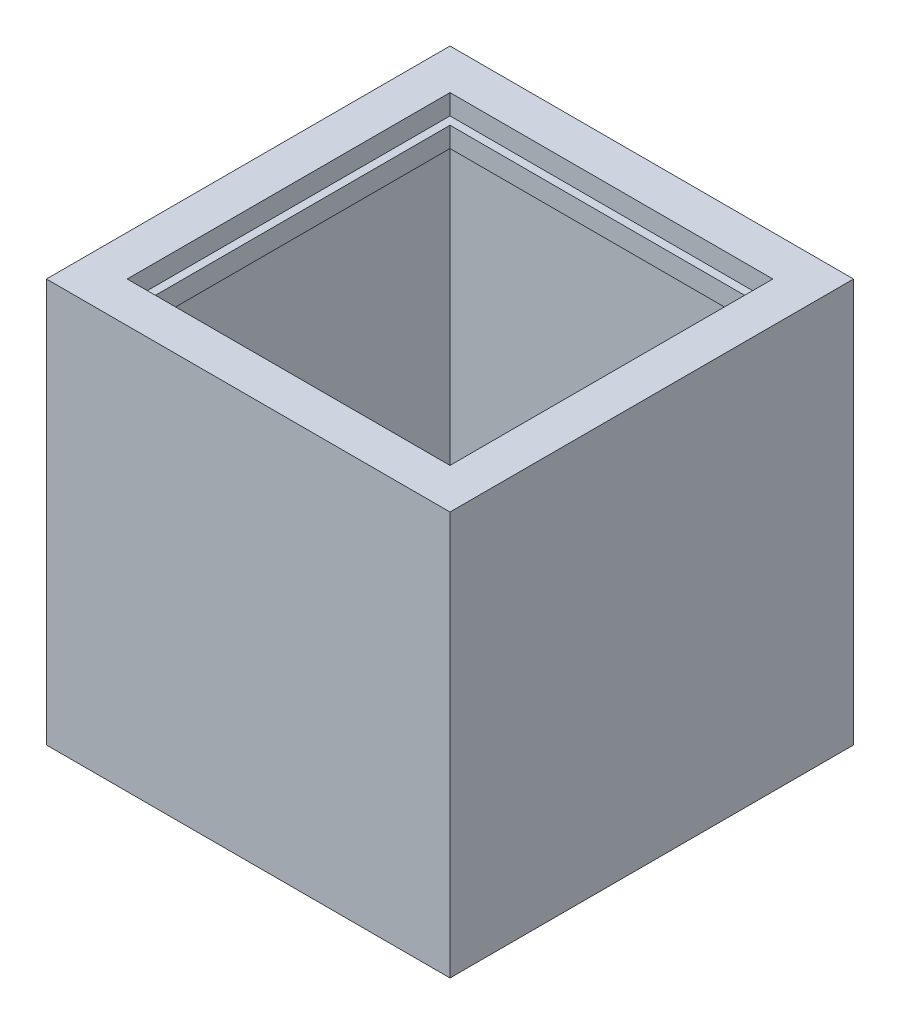
ISO-10303-21;
HEADER;
FILE_DESCRIPTION(('STEP AP214'),'2;1');
FILE_NAME('part.step','',(''),(''),'','','');
FILE_SCHEMA(('AUTOMOTIVE_DESIGN { 1 0 10303 214 1 1 1 1 }'));
ENDSEC;
DATA;
#1=APPLICATION_CONTEXT('core data for automotive mechanical design processes');
#2=APPLICATION_PROTOCOL_DEFINITION('international standard','automotive_design',2000,#1);
#3=PRODUCT_CONTEXT('',#1,'mechanical');
#4=PRODUCT('Part','Part','',(#3));
#5=PRODUCT_RELATED_PRODUCT_CATEGORY('part','',(#4));
#6=PRODUCT_DEFINITION_FORMATION('','',#4);
#7=PRODUCT_DEFINITION_CONTEXT('part definition',#1,'design');
#8=PRODUCT_DEFINITION('design','',#6,#7);
#9=PRODUCT_DEFINITION_SHAPE('','',#8);
#10=(LENGTH_UNIT() NAMED_UNIT(*) SI_UNIT(.MILLI.,.METRE.));
#11=(NAMED_UNIT(*) PLANE_ANGLE_UNIT() SI_UNIT($,.RADIAN.));
#12=(NAMED_UNIT(*) SI_UNIT($,.STERADIAN.) SOLID_ANGLE_UNIT());
#13=UNCERTAINTY_MEASURE_WITH_UNIT(LENGTH_MEASURE(1.E-05),#10,'distance_accuracy_value','');
#14=(GEOMETRIC_REPRESENTATION_CONTEXT(3) GLOBAL_UNCERTAINTY_ASSIGNED_CONTEXT((#13)) GLOBAL_UNIT_ASSIGNED_CONTEXT((#10,
#11,#12)) REPRESENTATION_CONTEXT('',''));
#15=CARTESIAN_POINT('',(0.,0.,0.));
#16=DIRECTION('',(0.,0.,1.));
#17=DIRECTION('',(1.,0.,0.));
#18=AXIS2_PLACEMENT_3D('',#15,#16,#17);
#19=CARTESIAN_POINT('',(-48.26,-54.61,15.24));
#20=DIRECTION('',(-1.,0.,0.));
#21=DIRECTION('',(0.,0.,1.));
#22=AXIS2_PLACEMENT_3D('',#19,#20,#21);
#23=PLANE('',#22);
#24=DIRECTION('',(0.,0.,-1.));
#25=VECTOR('',#24,1.);
#26=CARTESIAN_POINT('',(-48.26,50.8,8.89));
#27=LINE('',#26,#25);
#28=CARTESIAN_POINT('',(-48.26,50.8,111.76));
#29=VERTEX_POINT('',#28);
#30=CARTESIAN_POINT('',(-48.26,50.8,15.24));
#31=VERTEX_POINT('',#30);
#32=EDGE_CURVE('E190',#29,#31,#27,.T.);
#33=ORIENTED_EDGE('',*,*,#32,.T.);
#34=DIRECTION('',(0.,1.,0.));
#35=VECTOR('',#34,1.);
#36=CARTESIAN_POINT('',(-48.26,-54.61,15.24));
#37=LINE('',#36,#35);
#38=CARTESIAN_POINT('',(-48.26,57.15,15.24));
#39=VERTEX_POINT('',#38);
#40=EDGE_CURVE('E277',#31,#39,#37,.T.);
#41=ORIENTED_EDGE('',*,*,#40,.T.);
#42=DIRECTION('',(0.,0.,1.));
#43=VECTOR('',#42,1.);
#44=CARTESIAN_POINT('',(-48.26,57.15,15.24));
#45=LINE('',#44,#43);
#46=CARTESIAN_POINT('',(-48.26,57.15,111.76));
#47=VERTEX_POINT('',#46);
#48=EDGE_CURVE('E172',#39,#47,#45,.T.);
#49=ORIENTED_EDGE('',*,*,#48,.T.);
#50=DIRECTION('',(0.,1.,0.));
#51=VECTOR('',#50,1.);
#52=CARTESIAN_POINT('',(-48.26,-54.61,111.76));
#53=LINE('',#52,#51);
#54=EDGE_CURVE('E69',#29,#47,#53,.T.);
#55=ORIENTED_EDGE('',*,*,#54,.F.);
#56=EDGE_LOOP('',(#33,#41,#49,#55));
#57=FACE_BOUND('',#56,.T.);
#58=ADVANCED_FACE('F45',(#57),#23,.F.);
#59=CARTESIAN_POINT('',(-48.26,-54.61,111.76));
#60=DIRECTION('',(0.,0.,1.));
#61=DIRECTION('',(1.,0.,0.));
#62=AXIS2_PLACEMENT_3D('',#59,#60,#61);
#63=PLANE('',#62);
#64=DIRECTION('',(-1.,0.,0.));
#65=VECTOR('',#64,1.);
#66=CARTESIAN_POINT('',(-48.26,50.8,111.76));
#67=LINE('',#66,#65);
#68=CARTESIAN_POINT('',(48.26,50.8,111.76));
#69=VERTEX_POINT('',#68);
#70=EDGE_CURVE('E213',#69,#29,#67,.T.);
#71=ORIENTED_EDGE('',*,*,#70,.T.);
#72=ORIENTED_EDGE('',*,*,#54,.T.);
#73=DIRECTION('',(1.,0.,0.));
#74=VECTOR('',#73,1.);
#75=CARTESIAN_POINT('',(-48.26,57.15,111.76));
#76=LINE('',#75,#74);
#77=CARTESIAN_POINT('',(48.26,57.15,111.76));
#78=VERTEX_POINT('',#77);
#79=EDGE_CURVE('E232',#47,#78,#76,.T.);
#80=ORIENTED_EDGE('',*,*,#79,.T.);
#81=DIRECTION('',(0.,1.,0.));
#82=VECTOR('',#81,1.);
#83=CARTESIAN_POINT('',(48.26,-54.61,111.76));
#84=LINE('',#83,#82);
#85=EDGE_CURVE('E290',#69,#78,#84,.T.);
#86=ORIENTED_EDGE('',*,*,#85,.F.);
#87=EDGE_LOOP('',(#71,#72,#80,#86));
#88=FACE_BOUND('',#87,.T.);
#89=ADVANCED_FACE('F361',(#88),#63,.F.);
#90=CARTESIAN_POINT('',(63.5,-63.5,127.));
#91=DIRECTION('',(-1.,0.,0.));
#92=DIRECTION('',(0.,0.,1.));
#93=AXIS2_PLACEMENT_3D('',#90,#91,#92);
#94=PLANE('',#93);
#95=DIRECTION('',(0.,1.,0.));
#96=VECTOR('',#95,1.);
#97=CARTESIAN_POINT('',(63.5,-63.5,0.));
#98=LINE('',#97,#96);
#99=CARTESIAN_POINT('',(63.5,-63.5,0.));
#100=VERTEX_POINT('',#99);
#101=CARTESIAN_POINT('',(63.5,63.5,0.));
#102=VERTEX_POINT('',#101);
#103=EDGE_CURVE('E289',#100,#102,#98,.T.);
#104=ORIENTED_EDGE('',*,*,#103,.T.);
#105=DIRECTION('',(0.,0.,-1.));
#106=VECTOR('',#105,1.);
#107=CARTESIAN_POINT('',(63.5,63.5,127.));
#108=LINE('',#107,#106);
#109=CARTESIAN_POINT('',(63.5,63.5,127.));
#110=VERTEX_POINT('',#109);
#111=EDGE_CURVE('E11',#110,#102,#108,.T.);
#112=ORIENTED_EDGE('',*,*,#111,.F.);
#113=DIRECTION('',(0.,1.,0.));
#114=VECTOR('',#113,1.);
#115=CARTESIAN_POINT('',(63.5,-63.5,127.));
#116=LINE('',#115,#114);
#117=CARTESIAN_POINT('',(63.5,-63.5,127.));
#118=VERTEX_POINT('',#117);
#119=EDGE_CURVE('E297',#118,#110,#116,.T.);
#120=ORIENTED_EDGE('',*,*,#119,.F.);
#121=DIRECTION('',(0.,0.,-1.));
#122=VECTOR('',#121,1.);
#123=CARTESIAN_POINT('',(63.5,-63.5,127.));
#124=LINE('',#123,#122);
#125=EDGE_CURVE('E311',#118,#100,#124,.T.);
#126=ORIENTED_EDGE('',*,*,#125,.T.);
#127=EDGE_LOOP('',(#104,#112,#120,#126));
#128=FACE_BOUND('',#127,.T.);
#129=ADVANCED_FACE('F47',(#128),#94,.F.);
#130=CARTESIAN_POINT('',(-63.5,63.5,127.));
#131=DIRECTION('',(0.,-1.,0.));
#132=DIRECTION('',(0.,0.,-1.));
#133=AXIS2_PLACEMENT_3D('',#130,#131,#132);
#134=PLANE('',#133);
#135=DIRECTION('',(1.,0.,0.));
#136=VECTOR('',#135,1.);
#137=CARTESIAN_POINT('',(-50.8,63.5,114.3));
#138=LINE('',#137,#136);
#139=CARTESIAN_POINT('',(-50.8,63.5,114.3));
#140=VERTEX_POINT('',#139);
#141=CARTESIAN_POINT('',(50.8,63.5,114.3));
#142=VERTEX_POINT('',#141);
#143=EDGE_CURVE('E263',#140,#142,#138,.T.);
#144=ORIENTED_EDGE('',*,*,#143,.F.);
#145=DIRECTION('',(0.,0.,1.));
#146=VECTOR('',#145,1.);
#147=CARTESIAN_POINT('',(-50.8,63.5,12.7));
#148=LINE('',#147,#146);
#149=CARTESIAN_POINT('',(-50.8,63.5,12.7));
#150=VERTEX_POINT('',#149);
#151=EDGE_CURVE('E61',#150,#140,#148,.T.);
#152=ORIENTED_EDGE('',*,*,#151,.F.);
#153=DIRECTION('',(-1.,0.,0.));
#154=VECTOR('',#153,1.);
#155=CARTESIAN_POINT('',(50.8,63.5,12.7));
#156=LINE('',#155,#154);
#157=CARTESIAN_POINT('',(50.8,63.5,12.7));
#158=VERTEX_POINT('',#157);
#159=EDGE_CURVE('E248',#158,#150,#156,.T.);
#160=ORIENTED_EDGE('',*,*,#159,.F.);
#161=DIRECTION('',(0.,0.,-1.));
#162=VECTOR('',#161,1.);
#163=CARTESIAN_POINT('',(50.8,63.5,114.3));
#164=LINE('',#163,#162);
#165=EDGE_CURVE('E267',#142,#158,#164,.T.);
#166=ORIENTED_EDGE('',*,*,#165,.F.);
#167=EDGE_LOOP('',(#144,#152,#160,#166));
#168=FACE_BOUND('',#167,.T.);
#169=DIRECTION('',(-1.,0.,0.));
#170=VECTOR('',#169,1.);
#171=CARTESIAN_POINT('',(-63.5,63.5,0.));
#172=LINE('',#171,#170);
#173=CARTESIAN_POINT('',(-63.5,63.5,0.));
#174=VERTEX_POINT('',#173);
#175=EDGE_CURVE('E315',#102,#174,#172,.T.);
#176=ORIENTED_EDGE('',*,*,#175,.T.);
#177=DIRECTION('',(0.,0.,-1.));
#178=VECTOR('',#177,1.);
#179=CARTESIAN_POINT('',(-63.5,63.5,127.));
#180=LINE('',#179,#178);
#181=CARTESIAN_POINT('',(-63.5,63.5,127.));
#182=VERTEX_POINT('',#181);
#183=EDGE_CURVE('E54',#182,#174,#180,.T.);
#184=ORIENTED_EDGE('',*,*,#183,.F.);
#185=DIRECTION('',(-1.,0.,0.));
#186=VECTOR('',#185,1.);
#187=CARTESIAN_POINT('',(-63.5,63.5,127.));
#188=LINE('',#187,#186);
#189=EDGE_CURVE('E301',#110,#182,#188,.T.);
#190=ORIENTED_EDGE('',*,*,#189,.F.);
#191=ORIENTED_EDGE('',*,*,#111,.T.);
#192=EDGE_LOOP('',(#176,#184,#190,#191));
#193=FACE_BOUND('',#192,.T.);
#194=ADVANCED_FACE('F351',(#168,#193),#134,.F.);
#195=CARTESIAN_POINT('',(-63.5,-63.5,127.));
#196=DIRECTION('',(1.,0.,0.));
#197=DIRECTION('',(0.,0.,-1.));
#198=AXIS2_PLACEMENT_3D('',#195,#196,#197);
#199=PLANE('',#198);
#200=DIRECTION('',(0.,-1.,0.));
#201=VECTOR('',#200,1.);
#202=CARTESIAN_POINT('',(-63.5,-63.5,0.));
#203=LINE('',#202,#201);
#204=CARTESIAN_POINT('',(-63.5,-63.5,0.));
#205=VERTEX_POINT('',#204);
#206=EDGE_CURVE('E318',#174,#205,#203,.T.);
#207=ORIENTED_EDGE('',*,*,#206,.T.);
#208=DIRECTION('',(0.,0.,-1.));
#209=VECTOR('',#208,1.);
#210=CARTESIAN_POINT('',(-63.5,-63.5,127.));
#211=LINE('',#210,#209);
#212=CARTESIAN_POINT('',(-63.5,-63.5,127.));
#213=VERTEX_POINT('',#212);
#214=EDGE_CURVE('E326',#213,#205,#211,.T.);
#215=ORIENTED_EDGE('',*,*,#214,.F.);
#216=DIRECTION('',(0.,-1.,0.));
#217=VECTOR('',#216,1.);
#218=CARTESIAN_POINT('',(-63.5,-63.5,127.));
#219=LINE('',#218,#217);
#220=EDGE_CURVE('E305',#182,#213,#219,.T.);
#221=ORIENTED_EDGE('',*,*,#220,.F.);
#222=ORIENTED_EDGE('',*,*,#183,.T.);
#223=EDGE_LOOP('',(#207,#215,#221,#222));
#224=FACE_BOUND('',#223,.T.);
#225=ADVANCED_FACE('F335',(#224),#199,.F.);
#226=CARTESIAN_POINT('',(-63.5,-63.5,127.));
#227=DIRECTION('',(0.,1.,0.));
#228=DIRECTION('',(0.,0.,1.));
#229=AXIS2_PLACEMENT_3D('',#226,#227,#228);
#230=PLANE('',#229);
#231=DIRECTION('',(1.,0.,0.));
#232=VECTOR('',#231,1.);
#233=CARTESIAN_POINT('',(-63.5,-63.5,0.));
#234=LINE('',#233,#232);
#235=EDGE_CURVE('E302',#205,#100,#234,.T.);
#236=ORIENTED_EDGE('',*,*,#235,.T.);
#237=ORIENTED_EDGE('',*,*,#125,.F.);
#238=DIRECTION('',(1.,0.,0.));
#239=VECTOR('',#238,1.);
#240=CARTESIAN_POINT('',(-63.5,-63.5,127.));
#241=LINE('',#240,#239);
#242=EDGE_CURVE('E308',#213,#118,#241,.T.);
#243=ORIENTED_EDGE('',*,*,#242,.F.);
#244=ORIENTED_EDGE('',*,*,#214,.T.);
#245=EDGE_LOOP('',(#236,#237,#243,#244));
#246=FACE_BOUND('',#245,.T.);
#247=ADVANCED_FACE('F344',(#246),#230,.F.);
#248=CARTESIAN_POINT('',(0.,0.,127.));
#249=DIRECTION('',(0.,0.,-1.));
#250=DIRECTION('',(-1.,0.,0.));
#251=AXIS2_PLACEMENT_3D('',#248,#249,#250);
#252=PLANE('',#251);
#253=ORIENTED_EDGE('',*,*,#119,.T.);
#254=ORIENTED_EDGE('',*,*,#189,.T.);
#255=ORIENTED_EDGE('',*,*,#220,.T.);
#256=ORIENTED_EDGE('',*,*,#242,.T.);
#257=EDGE_LOOP('',(#253,#254,#255,#256));
#258=FACE_BOUND('',#257,.T.);
#259=ADVANCED_FACE('F350',(#258),#252,.F.);
#260=CARTESIAN_POINT('',(0.,0.,0.));
#261=DIRECTION('',(0.,0.,-1.));
#262=DIRECTION('',(-1.,0.,0.));
#263=AXIS2_PLACEMENT_3D('',#260,#261,#262);
#264=PLANE('',#263);
#265=ORIENTED_EDGE('',*,*,#103,.F.);
#266=ORIENTED_EDGE('',*,*,#235,.F.);
#267=ORIENTED_EDGE('',*,*,#206,.F.);
#268=ORIENTED_EDGE('',*,*,#175,.F.);
#269=EDGE_LOOP('',(#265,#266,#267,#268));
#270=FACE_BOUND('',#269,.T.);
#271=ADVANCED_FACE('F341',(#270),#264,.T.);
#272=CARTESIAN_POINT('',(-50.8,57.15,12.7));
#273=DIRECTION('',(-1.,0.,0.));
#274=DIRECTION('',(0.,0.,1.));
#275=AXIS2_PLACEMENT_3D('',#272,#273,#274);
#276=PLANE('',#275);
#277=ORIENTED_EDGE('',*,*,#151,.T.);
#278=DIRECTION('',(0.,1.,0.));
#279=VECTOR('',#278,1.);
#280=CARTESIAN_POINT('',(-50.8,57.15,114.3));
#281=LINE('',#280,#279);
#282=CARTESIAN_POINT('',(-50.8,57.15,114.3));
#283=VERTEX_POINT('',#282);
#284=EDGE_CURVE('E260',#283,#140,#281,.T.);
#285=ORIENTED_EDGE('',*,*,#284,.F.);
#286=DIRECTION('',(0.,0.,1.));
#287=VECTOR('',#286,1.);
#288=CARTESIAN_POINT('',(-50.8,57.15,12.7));
#289=LINE('',#288,#287);
#290=CARTESIAN_POINT('',(-50.8,57.15,12.7));
#291=VERTEX_POINT('',#290);
#292=EDGE_CURVE('E243',#291,#283,#289,.T.);
#293=ORIENTED_EDGE('',*,*,#292,.F.);
#294=DIRECTION('',(0.,1.,0.));
#295=VECTOR('',#294,1.);
#296=CARTESIAN_POINT('',(-50.8,57.15,12.7));
#297=LINE('',#296,#295);
#298=EDGE_CURVE('E274',#291,#150,#297,.T.);
#299=ORIENTED_EDGE('',*,*,#298,.T.);
#300=EDGE_LOOP('',(#277,#285,#293,#299));
#301=FACE_BOUND('',#300,.T.);
#302=ADVANCED_FACE('F381',(#301),#276,.F.);
#303=CARTESIAN_POINT('',(50.8,57.15,12.7));
#304=DIRECTION('',(0.,0.,-1.));
#305=DIRECTION('',(-1.,0.,0.));
#306=AXIS2_PLACEMENT_3D('',#303,#304,#305);
#307=PLANE('',#306);
#308=ORIENTED_EDGE('',*,*,#159,.T.);
#309=ORIENTED_EDGE('',*,*,#298,.F.);
#310=DIRECTION('',(-1.,0.,0.));
#311=VECTOR('',#310,1.);
#312=CARTESIAN_POINT('',(50.8,57.15,12.7));
#313=LINE('',#312,#311);
#314=CARTESIAN_POINT('',(50.8,57.15,12.7));
#315=VERTEX_POINT('',#314);
#316=EDGE_CURVE('E256',#315,#291,#313,.T.);
#317=ORIENTED_EDGE('',*,*,#316,.F.);
#318=DIRECTION('',(0.,1.,0.));
#319=VECTOR('',#318,1.);
#320=CARTESIAN_POINT('',(50.8,57.15,12.7));
#321=LINE('',#320,#319);
#322=EDGE_CURVE('E278',#315,#158,#321,.T.);
#323=ORIENTED_EDGE('',*,*,#322,.T.);
#324=EDGE_LOOP('',(#308,#309,#317,#323));
#325=FACE_BOUND('',#324,.T.);
#326=ADVANCED_FACE('F434',(#325),#307,.F.);
#327=CARTESIAN_POINT('',(50.8,57.15,114.3));
#328=DIRECTION('',(1.,0.,0.));
#329=DIRECTION('',(0.,0.,-1.));
#330=AXIS2_PLACEMENT_3D('',#327,#328,#329);
#331=PLANE('',#330);
#332=ORIENTED_EDGE('',*,*,#165,.T.);
#333=ORIENTED_EDGE('',*,*,#322,.F.);
#334=DIRECTION('',(0.,0.,-1.));
#335=VECTOR('',#334,1.);
#336=CARTESIAN_POINT('',(50.8,57.15,114.3));
#337=LINE('',#336,#335);
#338=CARTESIAN_POINT('',(50.8,57.15,114.3));
#339=VERTEX_POINT('',#338);
#340=EDGE_CURVE('E252',#339,#315,#337,.T.);
#341=ORIENTED_EDGE('',*,*,#340,.F.);
#342=DIRECTION('',(0.,1.,0.));
#343=VECTOR('',#342,1.);
#344=CARTESIAN_POINT('',(50.8,57.15,114.3));
#345=LINE('',#344,#343);
#346=EDGE_CURVE('E281',#339,#142,#345,.T.);
#347=ORIENTED_EDGE('',*,*,#346,.T.);
#348=EDGE_LOOP('',(#332,#333,#341,#347));
#349=FACE_BOUND('',#348,.T.);
#350=ADVANCED_FACE('F443',(#349),#331,.F.);
#351=CARTESIAN_POINT('',(-50.8,57.15,114.3));
#352=DIRECTION('',(0.,0.,1.));
#353=DIRECTION('',(1.,0.,0.));
#354=AXIS2_PLACEMENT_3D('',#351,#352,#353);
#355=PLANE('',#354);
#356=ORIENTED_EDGE('',*,*,#143,.T.);
#357=ORIENTED_EDGE('',*,*,#346,.F.);
#358=DIRECTION('',(1.,0.,0.));
#359=VECTOR('',#358,1.);
#360=CARTESIAN_POINT('',(-50.8,57.15,114.3));
#361=LINE('',#360,#359);
#362=EDGE_CURVE('E247',#283,#339,#361,.T.);
#363=ORIENTED_EDGE('',*,*,#362,.F.);
#364=ORIENTED_EDGE('',*,*,#284,.T.);
#365=EDGE_LOOP('',(#356,#357,#363,#364));
#366=FACE_BOUND('',#365,.T.);
#367=ADVANCED_FACE('F453',(#366),#355,.F.);
#368=CARTESIAN_POINT('',(0.,57.15,0.));
#369=DIRECTION('',(0.,1.,0.));
#370=DIRECTION('',(0.,0.,1.));
#371=AXIS2_PLACEMENT_3D('',#368,#369,#370);
#372=PLANE('',#371);
#373=DIRECTION('',(-1.,0.,0.));
#374=VECTOR('',#373,1.);
#375=CARTESIAN_POINT('',(-48.26,57.15,15.24));
#376=LINE('',#375,#374);
#377=CARTESIAN_POINT('',(48.26,57.15,15.24));
#378=VERTEX_POINT('',#377);
#379=EDGE_CURVE('E239',#378,#39,#376,.T.);
#380=ORIENTED_EDGE('',*,*,#379,.F.);
#381=DIRECTION('',(0.,0.,-1.));
#382=VECTOR('',#381,1.);
#383=CARTESIAN_POINT('',(48.26,57.15,15.24));
#384=LINE('',#383,#382);
#385=EDGE_CURVE('E235',#78,#378,#384,.T.);
#386=ORIENTED_EDGE('',*,*,#385,.F.);
#387=ORIENTED_EDGE('',*,*,#79,.F.);
#388=ORIENTED_EDGE('',*,*,#48,.F.);
#389=EDGE_LOOP('',(#380,#386,#387,#388));
#390=FACE_BOUND('',#389,.T.);
#391=ORIENTED_EDGE('',*,*,#292,.T.);
#392=ORIENTED_EDGE('',*,*,#362,.T.);
#393=ORIENTED_EDGE('',*,*,#340,.T.);
#394=ORIENTED_EDGE('',*,*,#316,.T.);
#395=EDGE_LOOP('',(#391,#392,#393,#394));
#396=FACE_BOUND('',#395,.T.);
#397=ADVANCED_FACE('F409',(#390,#396),#372,.T.);
#398=CARTESIAN_POINT('',(0.,-54.61,0.));
#399=DIRECTION('',(0.,1.,0.));
#400=DIRECTION('',(0.,0.,1.));
#401=AXIS2_PLACEMENT_3D('',#398,#399,#400);
#402=PLANE('',#401);
#403=DIRECTION('',(1.,0.,0.));
#404=VECTOR('',#403,1.);
#405=CARTESIAN_POINT('',(-48.26,-54.61,118.11));
#406=LINE('',#405,#404);
#407=CARTESIAN_POINT('',(-54.61,-54.61,118.11));
#408=VERTEX_POINT('',#407);
#409=CARTESIAN_POINT('',(54.61,-54.61,118.11));
#410=VERTEX_POINT('',#409);
#411=EDGE_CURVE('E218',#408,#410,#406,.T.);
#412=ORIENTED_EDGE('',*,*,#411,.T.);
#413=DIRECTION('',(0.,0.,1.));
#414=VECTOR('',#413,1.);
#415=CARTESIAN_POINT('',(54.61,-54.61,8.89));
#416=LINE('',#415,#414);
#417=CARTESIAN_POINT('',(54.61,-54.61,8.89));
#418=VERTEX_POINT('',#417);
#419=EDGE_CURVE('E202',#418,#410,#416,.T.);
#420=ORIENTED_EDGE('',*,*,#419,.F.);
#421=DIRECTION('',(1.,0.,0.));
#422=VECTOR('',#421,1.);
#423=CARTESIAN_POINT('',(-48.26,-54.61,8.89));
#424=LINE('',#423,#422);
#425=CARTESIAN_POINT('',(-54.61,-54.61,8.89));
#426=VERTEX_POINT('',#425);
#427=EDGE_CURVE('E173',#426,#418,#424,.T.);
#428=ORIENTED_EDGE('',*,*,#427,.F.);
#429=DIRECTION('',(0.,0.,1.));
#430=VECTOR('',#429,1.);
#431=CARTESIAN_POINT('',(-54.61,-54.61,8.89));
#432=LINE('',#431,#430);
#433=EDGE_CURVE('E188',#426,#408,#432,.T.);
#434=ORIENTED_EDGE('',*,*,#433,.T.);
#435=EDGE_LOOP('',(#412,#420,#428,#434));
#436=FACE_BOUND('',#435,.T.);
#437=ADVANCED_FACE('F403',(#436),#402,.T.);
#438=CARTESIAN_POINT('',(48.26,-54.61,111.76));
#439=DIRECTION('',(1.,0.,0.));
#440=DIRECTION('',(0.,0.,-1.));
#441=AXIS2_PLACEMENT_3D('',#438,#439,#440);
#442=PLANE('',#441);
#443=DIRECTION('',(0.,1.,0.));
#444=VECTOR('',#443,1.);
#445=CARTESIAN_POINT('',(48.26,-54.61,15.24));
#446=LINE('',#445,#444);
#447=CARTESIAN_POINT('',(48.26,50.8,15.24));
#448=VERTEX_POINT('',#447);
#449=EDGE_CURVE('E286',#448,#378,#446,.T.);
#450=ORIENTED_EDGE('',*,*,#449,.F.);
#451=DIRECTION('',(0.,0.,-1.));
#452=VECTOR('',#451,1.);
#453=CARTESIAN_POINT('',(48.26,50.8,8.89));
#454=LINE('',#453,#452);
#455=EDGE_CURVE('E198',#69,#448,#454,.T.);
#456=ORIENTED_EDGE('',*,*,#455,.F.);
#457=ORIENTED_EDGE('',*,*,#85,.T.);
#458=ORIENTED_EDGE('',*,*,#385,.T.);
#459=EDGE_LOOP('',(#450,#456,#457,#458));
#460=FACE_BOUND('',#459,.T.);
#461=ADVANCED_FACE('F376',(#460),#442,.F.);
#462=CARTESIAN_POINT('',(48.26,-54.61,15.24));
#463=DIRECTION('',(0.,0.,-1.));
#464=DIRECTION('',(-1.,0.,0.));
#465=AXIS2_PLACEMENT_3D('',#462,#463,#464);
#466=PLANE('',#465);
#467=ORIENTED_EDGE('',*,*,#40,.F.);
#468=DIRECTION('',(-1.,0.,0.));
#469=VECTOR('',#468,1.);
#470=CARTESIAN_POINT('',(-48.26,50.8,15.24));
#471=LINE('',#470,#469);
#472=EDGE_CURVE('E221',#448,#31,#471,.T.);
#473=ORIENTED_EDGE('',*,*,#472,.F.);
#474=ORIENTED_EDGE('',*,*,#449,.T.);
#475=ORIENTED_EDGE('',*,*,#379,.T.);
#476=EDGE_LOOP('',(#467,#473,#474,#475));
#477=FACE_BOUND('',#476,.T.);
#478=ADVANCED_FACE('F373',(#477),#466,.F.);
#479=CARTESIAN_POINT('',(-48.26,50.8,8.89));
#480=DIRECTION('',(0.,1.,0.));
#481=DIRECTION('',(0.,0.,1.));
#482=AXIS2_PLACEMENT_3D('',#479,#480,#481);
#483=PLANE('',#482);
#484=ORIENTED_EDGE('',*,*,#472,.T.);
#485=ORIENTED_EDGE('',*,*,#32,.F.);
#486=ORIENTED_EDGE('',*,*,#70,.F.);
#487=ORIENTED_EDGE('',*,*,#455,.T.);
#488=EDGE_LOOP('',(#484,#485,#486,#487));
#489=FACE_BOUND('',#488,.T.);
#490=DIRECTION('',(0.,0.,-1.));
#491=VECTOR('',#490,1.);
#492=CARTESIAN_POINT('',(-54.61,50.8,8.89));
#493=LINE('',#492,#491);
#494=CARTESIAN_POINT('',(-54.61,50.8,118.11));
#495=VERTEX_POINT('',#494);
#496=CARTESIAN_POINT('',(-54.61,50.8,8.89));
#497=VERTEX_POINT('',#496);
#498=EDGE_CURVE('E176',#495,#497,#493,.T.);
#499=ORIENTED_EDGE('',*,*,#498,.T.);
#500=DIRECTION('',(-1.,0.,0.));
#501=VECTOR('',#500,1.);
#502=CARTESIAN_POINT('',(-48.26,50.8,8.89));
#503=LINE('',#502,#501);
#504=CARTESIAN_POINT('',(54.61,50.8,8.89));
#505=VERTEX_POINT('',#504);
#506=EDGE_CURVE('E161',#505,#497,#503,.T.);
#507=ORIENTED_EDGE('',*,*,#506,.F.);
#508=DIRECTION('',(0.,0.,-1.));
#509=VECTOR('',#508,1.);
#510=CARTESIAN_POINT('',(54.61,50.8,8.89));
#511=LINE('',#510,#509);
#512=CARTESIAN_POINT('',(54.61,50.8,118.11));
#513=VERTEX_POINT('',#512);
#514=EDGE_CURVE('E210',#513,#505,#511,.T.);
#515=ORIENTED_EDGE('',*,*,#514,.F.);
#516=DIRECTION('',(-1.,0.,0.));
#517=VECTOR('',#516,1.);
#518=CARTESIAN_POINT('',(-48.26,50.8,118.11));
#519=LINE('',#518,#517);
#520=EDGE_CURVE('E178',#513,#495,#519,.T.);
#521=ORIENTED_EDGE('',*,*,#520,.T.);
#522=EDGE_LOOP('',(#499,#507,#515,#521));
#523=FACE_BOUND('',#522,.T.);
#524=ADVANCED_FACE('F177',(#489,#523),#483,.F.);
#525=CARTESIAN_POINT('',(0.,0.,8.89));
#526=DIRECTION('',(0.,0.,1.));
#527=DIRECTION('',(1.,0.,0.));
#528=AXIS2_PLACEMENT_3D('',#525,#526,#527);
#529=PLANE('',#528);
#530=ORIENTED_EDGE('',*,*,#506,.T.);
#531=DIRECTION('',(0.,-1.,0.));
#532=VECTOR('',#531,1.);
#533=CARTESIAN_POINT('',(-54.61,-54.61,8.89));
#534=LINE('',#533,#532);
#535=EDGE_CURVE('E165',#497,#426,#534,.T.);
#536=ORIENTED_EDGE('',*,*,#535,.T.);
#537=ORIENTED_EDGE('',*,*,#427,.T.);
#538=DIRECTION('',(0.,-1.,0.));
#539=VECTOR('',#538,1.);
#540=CARTESIAN_POINT('',(54.61,-54.61,8.89));
#541=LINE('',#540,#539);
#542=EDGE_CURVE('E167',#505,#418,#541,.T.);
#543=ORIENTED_EDGE('',*,*,#542,.F.);
#544=EDGE_LOOP('',(#530,#536,#537,#543));
#545=FACE_BOUND('',#544,.T.);
#546=ADVANCED_FACE('F163',(#545),#529,.T.);
#547=CARTESIAN_POINT('',(0.,0.,118.11));
#548=DIRECTION('',(0.,0.,-1.));
#549=DIRECTION('',(1.,0.,0.));
#550=AXIS2_PLACEMENT_3D('',#547,#548,#549);
#551=PLANE('',#550);
#552=ORIENTED_EDGE('',*,*,#411,.F.);
#553=DIRECTION('',(0.,1.,0.));
#554=VECTOR('',#553,1.);
#555=CARTESIAN_POINT('',(-54.61,-54.61,118.11));
#556=LINE('',#555,#554);
#557=EDGE_CURVE('E183',#408,#495,#556,.T.);
#558=ORIENTED_EDGE('',*,*,#557,.T.);
#559=ORIENTED_EDGE('',*,*,#520,.F.);
#560=DIRECTION('',(0.,1.,0.));
#561=VECTOR('',#560,1.);
#562=CARTESIAN_POINT('',(54.61,-54.61,118.11));
#563=LINE('',#562,#561);
#564=EDGE_CURVE('E206',#410,#513,#563,.T.);
#565=ORIENTED_EDGE('',*,*,#564,.F.);
#566=EDGE_LOOP('',(#552,#558,#559,#565));
#567=FACE_BOUND('',#566,.T.);
#568=ADVANCED_FACE('F483',(#567),#551,.T.);
#569=CARTESIAN_POINT('',(54.61,0.,0.));
#570=DIRECTION('',(1.,0.,0.));
#571=DIRECTION('',(0.,0.,-1.));
#572=AXIS2_PLACEMENT_3D('',#569,#570,#571);
#573=PLANE('',#572);
#574=ORIENTED_EDGE('',*,*,#542,.T.);
#575=ORIENTED_EDGE('',*,*,#419,.T.);
#576=ORIENTED_EDGE('',*,*,#564,.T.);
#577=ORIENTED_EDGE('',*,*,#514,.T.);
#578=EDGE_LOOP('',(#574,#575,#576,#577));
#579=FACE_BOUND('',#578,.T.);
#580=ADVANCED_FACE('F480',(#579),#573,.F.);
#581=CARTESIAN_POINT('',(-54.61,0.,0.));
#582=DIRECTION('',(-1.,0.,0.));
#583=DIRECTION('',(0.,0.,-1.));
#584=AXIS2_PLACEMENT_3D('',#581,#582,#583);
#585=PLANE('',#584);
#586=ORIENTED_EDGE('',*,*,#535,.F.);
#587=ORIENTED_EDGE('',*,*,#498,.F.);
#588=ORIENTED_EDGE('',*,*,#557,.F.);
#589=ORIENTED_EDGE('',*,*,#433,.F.);
#590=EDGE_LOOP('',(#586,#587,#588,#589));
#591=FACE_BOUND('',#590,.T.);
#592=ADVANCED_FACE('F186',(#591),#585,.F.);
#593=CLOSED_SHELL('',(#58,#89,#129,#194,#225,#247,#259,#271,#302,#326,#350,#367,#397,#437,#461,
#478,#524,#546,#568,#580,#592));
#594=MANIFOLD_SOLID_BREP('B2',#593);
#595=ADVANCED_BREP_SHAPE_REPRESENTATION('',(#18,#594),#14);
#596=SHAPE_DEFINITION_REPRESENTATION(#9,#595);
ENDSEC;
END-ISO-10303-21;
